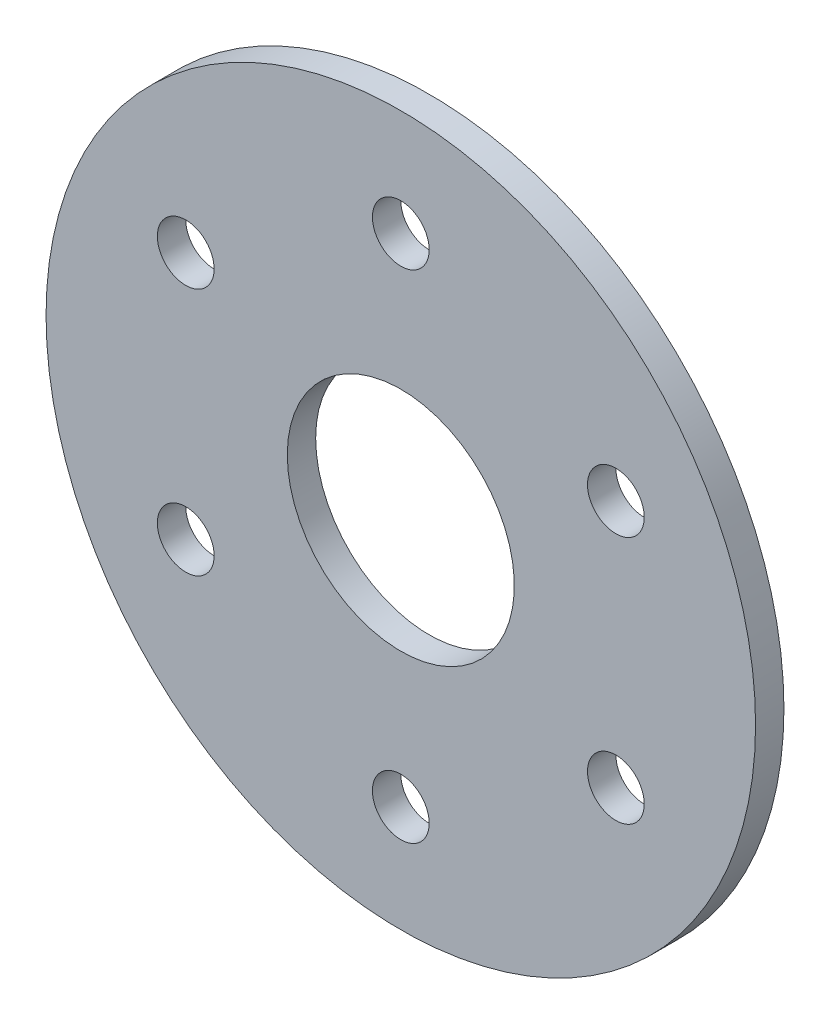
ISO-10303-21;
HEADER;
FILE_DESCRIPTION(('STEP AP214'),'2;1');
FILE_NAME('part.step','',(''),(''),'','','');
FILE_SCHEMA(('AUTOMOTIVE_DESIGN { 1 0 10303 214 1 1 1 1 }'));
ENDSEC;
DATA;
#1=APPLICATION_CONTEXT('core data for automotive mechanical design processes');
#2=APPLICATION_PROTOCOL_DEFINITION('international standard','automotive_design',2000,#1);
#3=PRODUCT_CONTEXT('',#1,'mechanical');
#4=PRODUCT('Part','Part','',(#3));
#5=PRODUCT_RELATED_PRODUCT_CATEGORY('part','',(#4));
#6=PRODUCT_DEFINITION_FORMATION('','',#4);
#7=PRODUCT_DEFINITION_CONTEXT('part definition',#1,'design');
#8=PRODUCT_DEFINITION('design','',#6,#7);
#9=PRODUCT_DEFINITION_SHAPE('','',#8);
#10=(LENGTH_UNIT() NAMED_UNIT(*) SI_UNIT(.MILLI.,.METRE.));
#11=(NAMED_UNIT(*) PLANE_ANGLE_UNIT() SI_UNIT($,.RADIAN.));
#12=(NAMED_UNIT(*) SI_UNIT($,.STERADIAN.) SOLID_ANGLE_UNIT());
#13=UNCERTAINTY_MEASURE_WITH_UNIT(LENGTH_MEASURE(1.E-05),#10,'distance_accuracy_value','');
#14=(GEOMETRIC_REPRESENTATION_CONTEXT(3) GLOBAL_UNCERTAINTY_ASSIGNED_CONTEXT((#13)) GLOBAL_UNIT_ASSIGNED_CONTEXT((#10,
#11,#12)) REPRESENTATION_CONTEXT('',''));
#15=CARTESIAN_POINT('',(0.,0.,0.));
#16=DIRECTION('',(0.,0.,1.));
#17=DIRECTION('',(1.,0.,0.));
#18=AXIS2_PLACEMENT_3D('',#15,#16,#17);
#19=CARTESIAN_POINT('',(0.,0.,1.));
#20=DIRECTION('',(0.,0.,-1.));
#21=DIRECTION('',(-1.,0.,0.));
#22=AXIS2_PLACEMENT_3D('',#19,#20,#21);
#23=CYLINDRICAL_SURFACE('',#22,12.5);
#24=CARTESIAN_POINT('',(0.,0.,1.));
#25=DIRECTION('',(0.,0.,1.));
#26=DIRECTION('',(1.,0.,0.));
#27=AXIS2_PLACEMENT_3D('',#24,#25,#26);
#28=CIRCLE('',#27,12.5);
#29=CARTESIAN_POINT('',(12.5,0.,1.));
#30=VERTEX_POINT('',#29);
#31=EDGE_CURVE('E10',#30,#30,#28,.T.);
#32=ORIENTED_EDGE('',*,*,#31,.F.);
#33=EDGE_LOOP('',(#32));
#34=FACE_BOUND('',#33,.T.);
#35=CARTESIAN_POINT('',(0.,0.,0.));
#36=DIRECTION('',(0.,0.,1.));
#37=DIRECTION('',(1.,0.,0.));
#38=AXIS2_PLACEMENT_3D('',#35,#36,#37);
#39=CIRCLE('',#38,12.5);
#40=CARTESIAN_POINT('',(12.5,0.,0.));
#41=VERTEX_POINT('',#40);
#42=EDGE_CURVE('E45',#41,#41,#39,.T.);
#43=ORIENTED_EDGE('',*,*,#42,.T.);
#44=EDGE_LOOP('',(#43));
#45=FACE_BOUND('',#44,.T.);
#46=ADVANCED_FACE('F37',(#34,#45),#23,.T.);
#47=CARTESIAN_POINT('',(0.,0.,1.));
#48=DIRECTION('',(0.,0.,1.));
#49=DIRECTION('',(1.,0.,0.));
#50=AXIS2_PLACEMENT_3D('',#47,#48,#49);
#51=PLANE('',#50);
#52=CARTESIAN_POINT('',(0.,0.,1.));
#53=DIRECTION('',(0.,0.,-1.));
#54=DIRECTION('',(-1.,0.,0.));
#55=AXIS2_PLACEMENT_3D('',#52,#53,#54);
#56=CIRCLE('',#55,4.);
#57=CARTESIAN_POINT('',(-4.,0.,1.));
#58=VERTEX_POINT('',#57);
#59=EDGE_CURVE('E131',#58,#58,#56,.T.);
#60=ORIENTED_EDGE('',*,*,#59,.T.);
#61=EDGE_LOOP('',(#60));
#62=FACE_BOUND('',#61,.T.);
#63=CARTESIAN_POINT('',(-7.57772228311379,4.37500000000009,1.));
#64=DIRECTION('',(0.,0.,1.));
#65=DIRECTION('',(0.50000000000001,0.866025403784433,0.));
#66=AXIS2_PLACEMENT_3D('',#63,#64,#65);
#67=CIRCLE('',#66,1.);
#68=CARTESIAN_POINT('',(-7.07772228311378,5.24102540378452,1.));
#69=VERTEX_POINT('',#68);
#70=EDGE_CURVE('E135',#69,#69,#67,.T.);
#71=ORIENTED_EDGE('',*,*,#70,.F.);
#72=EDGE_LOOP('',(#71));
#73=FACE_BOUND('',#72,.T.);
#74=CARTESIAN_POINT('',(-7.57772228311388,-4.37499999999993,1.));
#75=DIRECTION('',(0.,0.,1.));
#76=DIRECTION('',(-0.499999999999992,0.866025403784443,0.));
#77=AXIS2_PLACEMENT_3D('',#74,#75,#76);
#78=CIRCLE('',#77,1.);
#79=CARTESIAN_POINT('',(-8.07772228311387,-3.50897459621549,1.));
#80=VERTEX_POINT('',#79);
#81=EDGE_CURVE('E139',#80,#80,#78,.T.);
#82=ORIENTED_EDGE('',*,*,#81,.F.);
#83=EDGE_LOOP('',(#82));
#84=FACE_BOUND('',#83,.T.);
#85=CARTESIAN_POINT('',(0.,-8.75,1.));
#86=DIRECTION('',(0.,0.,1.));
#87=DIRECTION('',(-1.,0.,0.));
#88=AXIS2_PLACEMENT_3D('',#85,#86,#87);
#89=CIRCLE('',#88,1.);
#90=CARTESIAN_POINT('',(-1.,-8.75,1.));
#91=VERTEX_POINT('',#90);
#92=EDGE_CURVE('E147',#91,#91,#89,.T.);
#93=ORIENTED_EDGE('',*,*,#92,.F.);
#94=EDGE_LOOP('',(#93));
#95=FACE_BOUND('',#94,.T.);
#96=CARTESIAN_POINT('',(7.57772228311382,-4.37500000000004,1.));
#97=DIRECTION('',(0.,0.,1.));
#98=DIRECTION('',(-0.500000000000004,-0.866025403784436,0.));
#99=AXIS2_PLACEMENT_3D('',#96,#97,#98);
#100=CIRCLE('',#99,1.);
#101=CARTESIAN_POINT('',(7.07772228311382,-5.24102540378447,1.));
#102=VERTEX_POINT('',#101);
#103=EDGE_CURVE('E143',#102,#102,#100,.T.);
#104=ORIENTED_EDGE('',*,*,#103,.F.);
#105=EDGE_LOOP('',(#104));
#106=FACE_BOUND('',#105,.T.);
#107=CARTESIAN_POINT('',(7.57772228311385,4.37499999999998,1.));
#108=DIRECTION('',(0.,0.,1.));
#109=DIRECTION('',(0.499999999999998,-0.86602540378444,0.));
#110=AXIS2_PLACEMENT_3D('',#107,#108,#109);
#111=CIRCLE('',#110,1.);
#112=CARTESIAN_POINT('',(8.07772228311385,3.50897459621554,1.));
#113=VERTEX_POINT('',#112);
#114=EDGE_CURVE('E65',#113,#113,#111,.T.);
#115=ORIENTED_EDGE('',*,*,#114,.F.);
#116=EDGE_LOOP('',(#115));
#117=FACE_BOUND('',#116,.T.);
#118=CARTESIAN_POINT('',(0.,8.75,1.));
#119=DIRECTION('',(0.,0.,1.));
#120=DIRECTION('',(1.,0.,0.));
#121=AXIS2_PLACEMENT_3D('',#118,#119,#120);
#122=CIRCLE('',#121,1.);
#123=CARTESIAN_POINT('',(1.,8.75,1.));
#124=VERTEX_POINT('',#123);
#125=EDGE_CURVE('E54',#124,#124,#122,.T.);
#126=ORIENTED_EDGE('',*,*,#125,.F.);
#127=EDGE_LOOP('',(#126));
#128=FACE_BOUND('',#127,.T.);
#129=ORIENTED_EDGE('',*,*,#31,.T.);
#130=EDGE_LOOP('',(#129));
#131=FACE_BOUND('',#130,.T.);
#132=ADVANCED_FACE('F88',(#62,#73,#84,#95,#106,#117,#128,#131),#51,.T.);
#133=CARTESIAN_POINT('',(0.,0.,0.));
#134=DIRECTION('',(0.,0.,1.));
#135=DIRECTION('',(1.,0.,0.));
#136=AXIS2_PLACEMENT_3D('',#133,#134,#135);
#137=PLANE('',#136);
#138=CARTESIAN_POINT('',(0.,0.,0.));
#139=DIRECTION('',(0.,0.,1.));
#140=DIRECTION('',(1.,0.,0.));
#141=AXIS2_PLACEMENT_3D('',#138,#139,#140);
#142=CIRCLE('',#141,4.);
#143=CARTESIAN_POINT('',(4.,0.,0.));
#144=VERTEX_POINT('',#143);
#145=EDGE_CURVE('E40',#144,#144,#142,.T.);
#146=ORIENTED_EDGE('',*,*,#145,.T.);
#147=EDGE_LOOP('',(#146));
#148=FACE_BOUND('',#147,.T.);
#149=CARTESIAN_POINT('',(-7.57772228311379,4.37500000000009,0.));
#150=DIRECTION('',(0.,0.,1.));
#151=DIRECTION('',(1.,0.,0.));
#152=AXIS2_PLACEMENT_3D('',#149,#150,#151);
#153=CIRCLE('',#152,1.);
#154=CARTESIAN_POINT('',(-6.57772228311379,4.37500000000009,0.));
#155=VERTEX_POINT('',#154);
#156=EDGE_CURVE('E76',#155,#155,#153,.F.);
#157=ORIENTED_EDGE('',*,*,#156,.F.);
#158=EDGE_LOOP('',(#157));
#159=FACE_BOUND('',#158,.T.);
#160=CARTESIAN_POINT('',(-7.57772228311388,-4.37499999999993,0.));
#161=DIRECTION('',(0.,0.,1.));
#162=DIRECTION('',(1.,0.,0.));
#163=AXIS2_PLACEMENT_3D('',#160,#161,#162);
#164=CIRCLE('',#163,1.);
#165=CARTESIAN_POINT('',(-6.57772228311388,-4.37499999999993,0.));
#166=VERTEX_POINT('',#165);
#167=EDGE_CURVE('E73',#166,#166,#164,.F.);
#168=ORIENTED_EDGE('',*,*,#167,.F.);
#169=EDGE_LOOP('',(#168));
#170=FACE_BOUND('',#169,.T.);
#171=CARTESIAN_POINT('',(0.,-8.75,0.));
#172=DIRECTION('',(0.,0.,1.));
#173=DIRECTION('',(1.,0.,0.));
#174=AXIS2_PLACEMENT_3D('',#171,#172,#173);
#175=CIRCLE('',#174,1.);
#176=CARTESIAN_POINT('',(1.,-8.75,0.));
#177=VERTEX_POINT('',#176);
#178=EDGE_CURVE('E69',#177,#177,#175,.F.);
#179=ORIENTED_EDGE('',*,*,#178,.F.);
#180=EDGE_LOOP('',(#179));
#181=FACE_BOUND('',#180,.T.);
#182=CARTESIAN_POINT('',(7.57772228311382,-4.37500000000004,0.));
#183=DIRECTION('',(0.,0.,1.));
#184=DIRECTION('',(1.,0.,0.));
#185=AXIS2_PLACEMENT_3D('',#182,#183,#184);
#186=CIRCLE('',#185,1.);
#187=CARTESIAN_POINT('',(8.57772228311382,-4.37500000000004,0.));
#188=VERTEX_POINT('',#187);
#189=EDGE_CURVE('E64',#188,#188,#186,.F.);
#190=ORIENTED_EDGE('',*,*,#189,.F.);
#191=EDGE_LOOP('',(#190));
#192=FACE_BOUND('',#191,.T.);
#193=CARTESIAN_POINT('',(7.57772228311385,4.37499999999998,0.));
#194=DIRECTION('',(0.,0.,1.));
#195=DIRECTION('',(1.,0.,0.));
#196=AXIS2_PLACEMENT_3D('',#193,#194,#195);
#197=CIRCLE('',#196,1.);
#198=CARTESIAN_POINT('',(8.57772228311385,4.37499999999998,0.));
#199=VERTEX_POINT('',#198);
#200=EDGE_CURVE('E60',#199,#199,#197,.F.);
#201=ORIENTED_EDGE('',*,*,#200,.F.);
#202=EDGE_LOOP('',(#201));
#203=FACE_BOUND('',#202,.T.);
#204=CARTESIAN_POINT('',(0.,8.75,0.));
#205=DIRECTION('',(0.,0.,1.));
#206=DIRECTION('',(1.,0.,0.));
#207=AXIS2_PLACEMENT_3D('',#204,#205,#206);
#208=CIRCLE('',#207,1.);
#209=CARTESIAN_POINT('',(1.,8.75,0.));
#210=VERTEX_POINT('',#209);
#211=EDGE_CURVE('E51',#210,#210,#208,.F.);
#212=ORIENTED_EDGE('',*,*,#211,.F.);
#213=EDGE_LOOP('',(#212));
#214=FACE_BOUND('',#213,.T.);
#215=ORIENTED_EDGE('',*,*,#42,.F.);
#216=EDGE_LOOP('',(#215));
#217=FACE_BOUND('',#216,.T.);
#218=ADVANCED_FACE('F90',(#148,#159,#170,#181,#192,#203,#214,#217),#137,.F.);
#219=CARTESIAN_POINT('',(0.,8.75,1.));
#220=DIRECTION('',(0.,0.,-1.));
#221=DIRECTION('',(-1.,0.,0.));
#222=AXIS2_PLACEMENT_3D('',#219,#220,#221);
#223=CYLINDRICAL_SURFACE('',#222,1.);
#224=ORIENTED_EDGE('',*,*,#125,.T.);
#225=EDGE_LOOP('',(#224));
#226=FACE_BOUND('',#225,.T.);
#227=ORIENTED_EDGE('',*,*,#211,.T.);
#228=EDGE_LOOP('',(#227));
#229=FACE_BOUND('',#228,.T.);
#230=ADVANCED_FACE('F85',(#226,#229),#223,.F.);
#231=CARTESIAN_POINT('',(7.57772228311385,4.37499999999998,1.));
#232=DIRECTION('',(0.,0.,-1.));
#233=DIRECTION('',(-1.,0.,0.));
#234=AXIS2_PLACEMENT_3D('',#231,#232,#233);
#235=CYLINDRICAL_SURFACE('',#234,1.);
#236=ORIENTED_EDGE('',*,*,#114,.T.);
#237=EDGE_LOOP('',(#236));
#238=FACE_BOUND('',#237,.T.);
#239=ORIENTED_EDGE('',*,*,#200,.T.);
#240=EDGE_LOOP('',(#239));
#241=FACE_BOUND('',#240,.T.);
#242=ADVANCED_FACE('F104',(#238,#241),#235,.F.);
#243=CARTESIAN_POINT('',(7.57772228311382,-4.37500000000004,1.));
#244=DIRECTION('',(0.,0.,-1.));
#245=DIRECTION('',(-1.,0.,0.));
#246=AXIS2_PLACEMENT_3D('',#243,#244,#245);
#247=CYLINDRICAL_SURFACE('',#246,1.);
#248=ORIENTED_EDGE('',*,*,#103,.T.);
#249=EDGE_LOOP('',(#248));
#250=FACE_BOUND('',#249,.T.);
#251=ORIENTED_EDGE('',*,*,#189,.T.);
#252=EDGE_LOOP('',(#251));
#253=FACE_BOUND('',#252,.T.);
#254=ADVANCED_FACE('F107',(#250,#253),#247,.F.);
#255=CARTESIAN_POINT('',(0.,-8.75,1.));
#256=DIRECTION('',(0.,0.,-1.));
#257=DIRECTION('',(-1.,0.,0.));
#258=AXIS2_PLACEMENT_3D('',#255,#256,#257);
#259=CYLINDRICAL_SURFACE('',#258,1.);
#260=ORIENTED_EDGE('',*,*,#92,.T.);
#261=EDGE_LOOP('',(#260));
#262=FACE_BOUND('',#261,.T.);
#263=ORIENTED_EDGE('',*,*,#178,.T.);
#264=EDGE_LOOP('',(#263));
#265=FACE_BOUND('',#264,.T.);
#266=ADVANCED_FACE('F117',(#262,#265),#259,.F.);
#267=CARTESIAN_POINT('',(-7.57772228311388,-4.37499999999993,1.));
#268=DIRECTION('',(0.,0.,-1.));
#269=DIRECTION('',(-1.,0.,0.));
#270=AXIS2_PLACEMENT_3D('',#267,#268,#269);
#271=CYLINDRICAL_SURFACE('',#270,1.);
#272=ORIENTED_EDGE('',*,*,#81,.T.);
#273=EDGE_LOOP('',(#272));
#274=FACE_BOUND('',#273,.T.);
#275=ORIENTED_EDGE('',*,*,#167,.T.);
#276=EDGE_LOOP('',(#275));
#277=FACE_BOUND('',#276,.T.);
#278=ADVANCED_FACE('F113',(#274,#277),#271,.F.);
#279=CARTESIAN_POINT('',(-7.57772228311379,4.37500000000009,1.));
#280=DIRECTION('',(0.,0.,-1.));
#281=DIRECTION('',(-1.,0.,0.));
#282=AXIS2_PLACEMENT_3D('',#279,#280,#281);
#283=CYLINDRICAL_SURFACE('',#282,1.);
#284=ORIENTED_EDGE('',*,*,#70,.T.);
#285=EDGE_LOOP('',(#284));
#286=FACE_BOUND('',#285,.T.);
#287=ORIENTED_EDGE('',*,*,#156,.T.);
#288=EDGE_LOOP('',(#287));
#289=FACE_BOUND('',#288,.T.);
#290=ADVANCED_FACE('F109',(#286,#289),#283,.F.);
#291=CARTESIAN_POINT('',(0.,0.,1.));
#292=DIRECTION('',(0.,0.,-1.));
#293=DIRECTION('',(-1.,0.,0.));
#294=AXIS2_PLACEMENT_3D('',#291,#292,#293);
#295=CYLINDRICAL_SURFACE('',#294,4.);
#296=ORIENTED_EDGE('',*,*,#59,.F.);
#297=EDGE_LOOP('',(#296));
#298=FACE_BOUND('',#297,.T.);
#299=ORIENTED_EDGE('',*,*,#145,.F.);
#300=EDGE_LOOP('',(#299));
#301=FACE_BOUND('',#300,.T.);
#302=ADVANCED_FACE('F112',(#298,#301),#295,.F.);
#303=CLOSED_SHELL('',(#46,#132,#218,#230,#242,#254,#266,#278,#290,#302));
#304=MANIFOLD_SOLID_BREP('B2',#303);
#305=ADVANCED_BREP_SHAPE_REPRESENTATION('',(#18,#304),#14);
#306=SHAPE_DEFINITION_REPRESENTATION(#9,#305);
ENDSEC;
END-ISO-10303-21;
